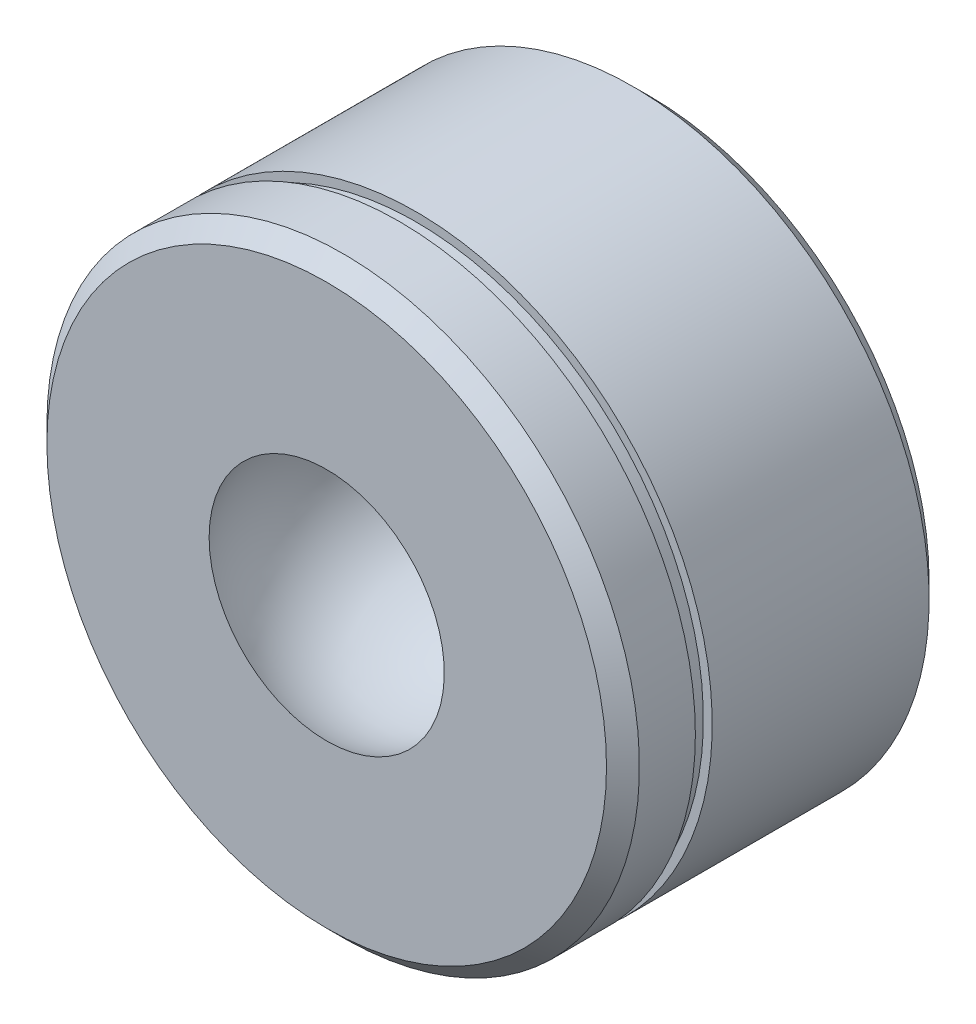
ISO-10303-21;
HEADER;
FILE_DESCRIPTION(('STEP AP214'),'2;1');
FILE_NAME('part.step','',(''),(''),'','','');
FILE_SCHEMA(('AUTOMOTIVE_DESIGN { 1 0 10303 214 1 1 1 1 }'));
ENDSEC;
DATA;
#1=APPLICATION_CONTEXT('core data for automotive mechanical design processes');
#2=APPLICATION_PROTOCOL_DEFINITION('international standard','automotive_design',2000,#1);
#3=PRODUCT_CONTEXT('',#1,'mechanical');
#4=PRODUCT('Part','Part','',(#3));
#5=PRODUCT_RELATED_PRODUCT_CATEGORY('part','',(#4));
#6=PRODUCT_DEFINITION_FORMATION('','',#4);
#7=PRODUCT_DEFINITION_CONTEXT('part definition',#1,'design');
#8=PRODUCT_DEFINITION('design','',#6,#7);
#9=PRODUCT_DEFINITION_SHAPE('','',#8);
#10=(LENGTH_UNIT() NAMED_UNIT(*) SI_UNIT(.MILLI.,.METRE.));
#11=(NAMED_UNIT(*) PLANE_ANGLE_UNIT() SI_UNIT($,.RADIAN.));
#12=(NAMED_UNIT(*) SI_UNIT($,.STERADIAN.) SOLID_ANGLE_UNIT());
#13=UNCERTAINTY_MEASURE_WITH_UNIT(LENGTH_MEASURE(1.E-05),#10,'distance_accuracy_value','');
#14=(GEOMETRIC_REPRESENTATION_CONTEXT(3) GLOBAL_UNCERTAINTY_ASSIGNED_CONTEXT((#13)) GLOBAL_UNIT_ASSIGNED_CONTEXT((#10,
#11,#12)) REPRESENTATION_CONTEXT('',''));
#15=CARTESIAN_POINT('',(0.,0.,0.));
#16=DIRECTION('',(0.,0.,1.));
#17=DIRECTION('',(1.,0.,0.));
#18=AXIS2_PLACEMENT_3D('',#15,#16,#17);
#19=CARTESIAN_POINT('',(0.,0.,15.));
#20=DIRECTION('',(0.,0.,-1.));
#21=DIRECTION('',(-1.,0.,0.));
#22=AXIS2_PLACEMENT_3D('',#19,#20,#21);
#23=CYLINDRICAL_SURFACE('',#22,9.);
#24=CARTESIAN_POINT('',(0.,0.,0.5));
#25=DIRECTION('',(0.,0.,1.));
#26=DIRECTION('',(-1.,0.,0.));
#27=AXIS2_PLACEMENT_3D('',#24,#25,#26);
#28=CIRCLE('',#27,9.);
#29=CARTESIAN_POINT('',(-9.,0.,0.5));
#30=VERTEX_POINT('',#29);
#31=EDGE_CURVE('E11',#30,#30,#28,.T.);
#32=ORIENTED_EDGE('',*,*,#31,.T.);
#33=EDGE_LOOP('',(#32));
#34=FACE_BOUND('',#33,.T.);
#35=CARTESIAN_POINT('',(0.,0.,7.08828414356868));
#36=DIRECTION('',(0.,0.,1.));
#37=DIRECTION('',(-1.,0.,0.));
#38=AXIS2_PLACEMENT_3D('',#35,#36,#37);
#39=CIRCLE('',#38,9.);
#40=CARTESIAN_POINT('',(-9.,0.,7.08828414356868));
#41=VERTEX_POINT('',#40);
#42=EDGE_CURVE('E97',#41,#41,#39,.T.);
#43=ORIENTED_EDGE('',*,*,#42,.F.);
#44=EDGE_LOOP('',(#43));
#45=FACE_BOUND('',#44,.T.);
#46=ADVANCED_FACE('F16',(#34,#45),#23,.T.);
#47=CARTESIAN_POINT('',(0.,0.,0.));
#48=DIRECTION('',(0.,0.,1.));
#49=DIRECTION('',(1.,0.,0.));
#50=AXIS2_PLACEMENT_3D('',#47,#48,#49);
#51=CONICAL_SURFACE('',#50,8.5,0.785398163397448);
#52=CARTESIAN_POINT('',(0.,0.,0.));
#53=DIRECTION('',(0.,0.,-1.));
#54=DIRECTION('',(-1.,0.,0.));
#55=AXIS2_PLACEMENT_3D('',#52,#53,#54);
#56=CIRCLE('',#55,8.5);
#57=CARTESIAN_POINT('',(-8.5,0.,0.));
#58=VERTEX_POINT('',#57);
#59=EDGE_CURVE('E26',#58,#58,#56,.T.);
#60=ORIENTED_EDGE('',*,*,#59,.F.);
#61=EDGE_LOOP('',(#60));
#62=FACE_BOUND('',#61,.T.);
#63=ORIENTED_EDGE('',*,*,#31,.F.);
#64=EDGE_LOOP('',(#63));
#65=FACE_BOUND('',#64,.T.);
#66=ADVANCED_FACE('F120',(#62,#65),#51,.T.);
#67=CARTESIAN_POINT('',(0.,0.,0.));
#68=DIRECTION('',(0.,0.,-1.));
#69=DIRECTION('',(0.,-1.,0.));
#70=AXIS2_PLACEMENT_3D('',#67,#68,#69);
#71=PLANE('',#70);
#72=ORIENTED_EDGE('',*,*,#59,.T.);
#73=EDGE_LOOP('',(#72));
#74=FACE_BOUND('',#73,.T.);
#75=ADVANCED_FACE('F116',(#74),#71,.T.);
#76=CARTESIAN_POINT('',(0.,-8.73194237699615,7.08828414356868));
#77=DIRECTION('',(0.,0.,-1.));
#78=DIRECTION('',(0.,-1.,0.));
#79=AXIS2_PLACEMENT_3D('',#76,#77,#78);
#80=PLANE('',#79);
#81=CARTESIAN_POINT('',(0.,0.,7.08828414356868));
#82=DIRECTION('',(0.,0.,-1.));
#83=DIRECTION('',(-1.,0.,0.));
#84=AXIS2_PLACEMENT_3D('',#81,#82,#83);
#85=CIRCLE('',#84,8.73194237699615);
#86=CARTESIAN_POINT('',(-8.73194237699615,0.,7.08828414356868));
#87=VERTEX_POINT('',#86);
#88=EDGE_CURVE('E80',#87,#87,#85,.T.);
#89=ORIENTED_EDGE('',*,*,#88,.T.);
#90=EDGE_LOOP('',(#89));
#91=FACE_BOUND('',#90,.T.);
#92=ORIENTED_EDGE('',*,*,#42,.T.);
#93=EDGE_LOOP('',(#92));
#94=FACE_BOUND('',#93,.T.);
#95=ADVANCED_FACE('F103',(#91,#94),#80,.F.);
#96=CARTESIAN_POINT('',(0.,0.,-0.163749074058028));
#97=DIRECTION('',(0.,0.,-1.));
#98=DIRECTION('',(-1.,0.,0.));
#99=AXIS2_PLACEMENT_3D('',#96,#97,#98);
#100=CYLINDRICAL_SURFACE('',#99,8.73194237699615);
#101=CARTESIAN_POINT('',(0.,0.,7.6));
#102=DIRECTION('',(0.,0.,-1.));
#103=DIRECTION('',(-1.,0.,0.));
#104=AXIS2_PLACEMENT_3D('',#101,#102,#103);
#105=CIRCLE('',#104,8.73194237699615);
#106=CARTESIAN_POINT('',(-8.73194237699615,0.,7.6));
#107=VERTEX_POINT('',#106);
#108=EDGE_CURVE('E19',#107,#107,#105,.T.);
#109=ORIENTED_EDGE('',*,*,#108,.T.);
#110=EDGE_LOOP('',(#109));
#111=FACE_BOUND('',#110,.T.);
#112=ORIENTED_EDGE('',*,*,#88,.F.);
#113=EDGE_LOOP('',(#112));
#114=FACE_BOUND('',#113,.T.);
#115=ADVANCED_FACE('F106',(#111,#114),#100,.T.);
#116=CARTESIAN_POINT('',(0.,-9.57627354010783,7.6));
#117=DIRECTION('',(0.,0.,1.));
#118=DIRECTION('',(1.,0.,0.));
#119=AXIS2_PLACEMENT_3D('',#116,#117,#118);
#120=PLANE('',#119);
#121=CARTESIAN_POINT('',(0.,0.,7.6));
#122=DIRECTION('',(0.,0.,-1.));
#123=DIRECTION('',(1.,0.,0.));
#124=AXIS2_PLACEMENT_3D('',#121,#122,#123);
#125=CIRCLE('',#124,9.);
#126=CARTESIAN_POINT('',(9.,0.,7.6));
#127=VERTEX_POINT('',#126);
#128=EDGE_CURVE('E87',#127,#127,#125,.T.);
#129=ORIENTED_EDGE('',*,*,#128,.T.);
#130=EDGE_LOOP('',(#129));
#131=FACE_BOUND('',#130,.T.);
#132=ORIENTED_EDGE('',*,*,#108,.F.);
#133=EDGE_LOOP('',(#132));
#134=FACE_BOUND('',#133,.T.);
#135=ADVANCED_FACE('F108',(#131,#134),#120,.F.);
#136=CARTESIAN_POINT('',(0.,0.,9.3));
#137=DIRECTION('',(0.,0.,-1.));
#138=DIRECTION('',(-1.,0.,0.));
#139=AXIS2_PLACEMENT_3D('',#136,#137,#138);
#140=CONICAL_SURFACE('',#139,9.,0.785398163397448);
#141=CARTESIAN_POINT('',(0.,0.,9.3));
#142=DIRECTION('',(0.,0.,-1.));
#143=DIRECTION('',(-1.,0.,0.));
#144=AXIS2_PLACEMENT_3D('',#141,#142,#143);
#145=CIRCLE('',#144,9.);
#146=CARTESIAN_POINT('',(-9.,0.,9.3));
#147=VERTEX_POINT('',#146);
#148=EDGE_CURVE('E82',#147,#147,#145,.T.);
#149=ORIENTED_EDGE('',*,*,#148,.F.);
#150=EDGE_LOOP('',(#149));
#151=FACE_BOUND('',#150,.T.);
#152=CARTESIAN_POINT('',(0.,0.,9.8));
#153=DIRECTION('',(0.,0.,1.));
#154=DIRECTION('',(-1.,0.,0.));
#155=AXIS2_PLACEMENT_3D('',#152,#153,#154);
#156=CIRCLE('',#155,8.5);
#157=CARTESIAN_POINT('',(-8.5,0.,9.8));
#158=VERTEX_POINT('',#157);
#159=EDGE_CURVE('E75',#158,#158,#156,.T.);
#160=ORIENTED_EDGE('',*,*,#159,.F.);
#161=EDGE_LOOP('',(#160));
#162=FACE_BOUND('',#161,.T.);
#163=ADVANCED_FACE('F114',(#151,#162),#140,.T.);
#164=CARTESIAN_POINT('',(0.,0.,8.));
#165=DIRECTION('',(0.,0.,-1.));
#166=DIRECTION('',(0.,-1.,0.));
#167=AXIS2_PLACEMENT_3D('',#164,#165,#166);
#168=SPHERICAL_SURFACE('',#167,4.);
#169=CARTESIAN_POINT('',(0.,0.,9.8));
#170=DIRECTION('',(0.,0.,-1.));
#171=DIRECTION('',(-1.,0.,0.));
#172=AXIS2_PLACEMENT_3D('',#169,#170,#171);
#173=CIRCLE('',#172,3.57211421989835);
#174=CARTESIAN_POINT('',(-3.57211421989835,0.,9.8));
#175=VERTEX_POINT('',#174);
#176=EDGE_CURVE('E70',#175,#175,#173,.T.);
#177=ORIENTED_EDGE('',*,*,#176,.F.);
#178=EDGE_LOOP('',(#177));
#179=FACE_BOUND('',#178,.T.);
#180=ADVANCED_FACE('F140',(#179),#168,.F.);
#181=CARTESIAN_POINT('',(0.,0.,9.8));
#182=DIRECTION('',(0.,0.,-1.));
#183=DIRECTION('',(0.,-1.,0.));
#184=AXIS2_PLACEMENT_3D('',#181,#182,#183);
#185=PLANE('',#184);
#186=ORIENTED_EDGE('',*,*,#176,.T.);
#187=EDGE_LOOP('',(#186));
#188=FACE_BOUND('',#187,.T.);
#189=ORIENTED_EDGE('',*,*,#159,.T.);
#190=EDGE_LOOP('',(#189));
#191=FACE_BOUND('',#190,.T.);
#192=ADVANCED_FACE('F71',(#188,#191),#185,.F.);
#193=CARTESIAN_POINT('',(0.,0.,15.));
#194=DIRECTION('',(0.,0.,-1.));
#195=DIRECTION('',(-1.,0.,0.));
#196=AXIS2_PLACEMENT_3D('',#193,#194,#195);
#197=CYLINDRICAL_SURFACE('',#196,9.);
#198=ORIENTED_EDGE('',*,*,#148,.T.);
#199=EDGE_LOOP('',(#198));
#200=FACE_BOUND('',#199,.T.);
#201=ORIENTED_EDGE('',*,*,#128,.F.);
#202=EDGE_LOOP('',(#201));
#203=FACE_BOUND('',#202,.T.);
#204=ADVANCED_FACE('F135',(#200,#203),#197,.T.);
#205=CLOSED_SHELL('',(#46,#66,#75,#95,#115,#135,#163,#180,#192,#204));
#206=MANIFOLD_SOLID_BREP('B1',#205);
#207=ADVANCED_BREP_SHAPE_REPRESENTATION('',(#18,#206),#14);
#208=SHAPE_DEFINITION_REPRESENTATION(#9,#207);
ENDSEC;
END-ISO-10303-21;
